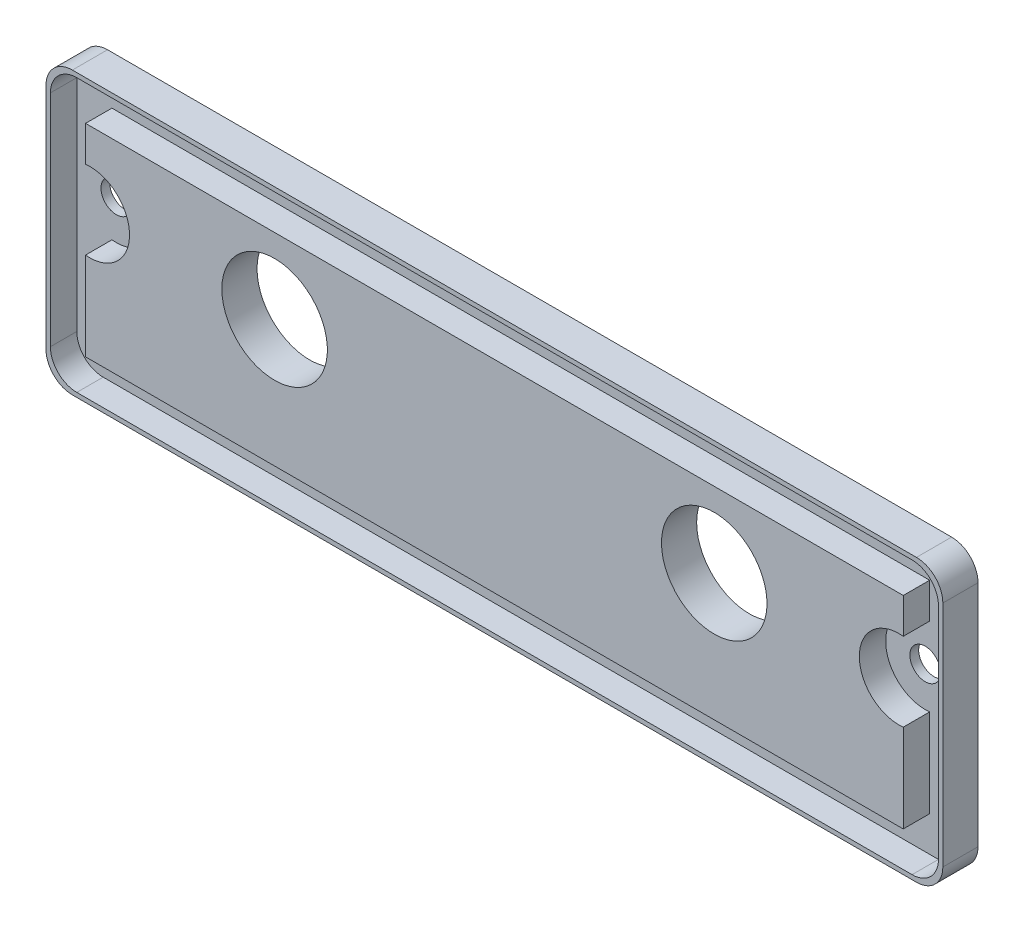
ISO-10303-21;
HEADER;
FILE_DESCRIPTION(('STEP AP214'),'2;1');
FILE_NAME('part.step','',(''),(''),'','','');
FILE_SCHEMA(('AUTOMOTIVE_DESIGN { 1 0 10303 214 1 1 1 1 }'));
ENDSEC;
DATA;
#1=APPLICATION_CONTEXT('core data for automotive mechanical design processes');
#2=APPLICATION_PROTOCOL_DEFINITION('international standard','automotive_design',2000,#1);
#3=PRODUCT_CONTEXT('',#1,'mechanical');
#4=PRODUCT('Part','Part','',(#3));
#5=PRODUCT_RELATED_PRODUCT_CATEGORY('part','',(#4));
#6=PRODUCT_DEFINITION_FORMATION('','',#4);
#7=PRODUCT_DEFINITION_CONTEXT('part definition',#1,'design');
#8=PRODUCT_DEFINITION('design','',#6,#7);
#9=PRODUCT_DEFINITION_SHAPE('','',#8);
#10=(LENGTH_UNIT() NAMED_UNIT(*) SI_UNIT(.MILLI.,.METRE.));
#11=(NAMED_UNIT(*) PLANE_ANGLE_UNIT() SI_UNIT($,.RADIAN.));
#12=(NAMED_UNIT(*) SI_UNIT($,.STERADIAN.) SOLID_ANGLE_UNIT());
#13=UNCERTAINTY_MEASURE_WITH_UNIT(LENGTH_MEASURE(1.E-05),#10,'distance_accuracy_value','');
#14=(GEOMETRIC_REPRESENTATION_CONTEXT(3) GLOBAL_UNCERTAINTY_ASSIGNED_CONTEXT((#13)) GLOBAL_UNIT_ASSIGNED_CONTEXT((#10,
#11,#12)) REPRESENTATION_CONTEXT('',''));
#15=CARTESIAN_POINT('',(0.,0.,0.));
#16=DIRECTION('',(0.,0.,1.));
#17=DIRECTION('',(1.,0.,0.));
#18=AXIS2_PLACEMENT_3D('',#15,#16,#17);
#19=CARTESIAN_POINT('',(0.,0.,1.));
#20=DIRECTION('',(0.,0.,1.));
#21=DIRECTION('',(1.,0.,0.));
#22=AXIS2_PLACEMENT_3D('',#19,#20,#21);
#23=PLANE('',#22);
#24=CARTESIAN_POINT('',(-5.,19.,1.));
#25=DIRECTION('',(0.,0.,1.));
#26=DIRECTION('',(1.,0.,0.));
#27=AXIS2_PLACEMENT_3D('',#24,#25,#26);
#28=CIRCLE('',#27,1.75000000000001);
#29=CARTESIAN_POINT('',(-3.24999999999999,19.,1.));
#30=VERTEX_POINT('',#29);
#31=EDGE_CURVE('E470',#30,#30,#28,.T.);
#32=ORIENTED_EDGE('',*,*,#31,.F.);
#33=EDGE_LOOP('',(#32));
#34=FACE_BOUND('',#33,.T.);
#35=CARTESIAN_POINT('',(-97.,19.,1.));
#36=DIRECTION('',(0.,0.,1.));
#37=DIRECTION('',(1.,0.,0.));
#38=AXIS2_PLACEMENT_3D('',#35,#36,#37);
#39=CIRCLE('',#38,1.75);
#40=CARTESIAN_POINT('',(-95.25,19.,1.));
#41=VERTEX_POINT('',#40);
#42=EDGE_CURVE('E464',#41,#41,#39,.T.);
#43=ORIENTED_EDGE('',*,*,#42,.F.);
#44=EDGE_LOOP('',(#43));
#45=FACE_BOUND('',#44,.T.);
#46=CARTESIAN_POINT('',(-5.,19.,1.));
#47=DIRECTION('',(0.,0.,1.));
#48=DIRECTION('',(1.,0.,0.));
#49=AXIS2_PLACEMENT_3D('',#46,#47,#48);
#50=CIRCLE('',#49,4.5);
#51=CARTESIAN_POINT('',(-4.5,23.4721359549995,1.));
#52=VERTEX_POINT('',#51);
#53=CARTESIAN_POINT('',(-4.5,14.5278640450004,1.));
#54=VERTEX_POINT('',#53);
#55=EDGE_CURVE('E242',#52,#54,#50,.T.);
#56=ORIENTED_EDGE('',*,*,#55,.T.);
#57=DIRECTION('',(0.,-1.,0.));
#58=VECTOR('',#57,1.);
#59=CARTESIAN_POINT('',(-4.5,0.,1.));
#60=LINE('',#59,#58);
#61=CARTESIAN_POINT('',(-4.5,4.49999999999997,1.));
#62=VERTEX_POINT('',#61);
#63=EDGE_CURVE('E260',#54,#62,#60,.T.);
#64=ORIENTED_EDGE('',*,*,#63,.T.);
#65=DIRECTION('',(1.,0.,0.));
#66=VECTOR('',#65,1.);
#67=CARTESIAN_POINT('',(0.,4.49999999999997,1.));
#68=LINE('',#67,#66);
#69=CARTESIAN_POINT('',(-97.5,4.49999999999997,1.));
#70=VERTEX_POINT('',#69);
#71=EDGE_CURVE('E262',#70,#62,#68,.T.);
#72=ORIENTED_EDGE('',*,*,#71,.F.);
#73=DIRECTION('',(0.,-1.,0.));
#74=VECTOR('',#73,1.);
#75=CARTESIAN_POINT('',(-97.5,0.,1.));
#76=LINE('',#75,#74);
#77=CARTESIAN_POINT('',(-97.5,14.5278640450004,1.));
#78=VERTEX_POINT('',#77);
#79=EDGE_CURVE('E291',#78,#70,#76,.T.);
#80=ORIENTED_EDGE('',*,*,#79,.F.);
#81=CARTESIAN_POINT('',(-97.,19.,1.));
#82=DIRECTION('',(0.,0.,1.));
#83=DIRECTION('',(1.,0.,0.));
#84=AXIS2_PLACEMENT_3D('',#81,#82,#83);
#85=CIRCLE('',#84,4.5);
#86=CARTESIAN_POINT('',(-97.5,23.4721359549996,1.));
#87=VERTEX_POINT('',#86);
#88=EDGE_CURVE('E288',#87,#78,#85,.F.);
#89=ORIENTED_EDGE('',*,*,#88,.F.);
#90=DIRECTION('',(0.,-1.,0.));
#91=VECTOR('',#90,1.);
#92=CARTESIAN_POINT('',(-97.5,0.,1.));
#93=LINE('',#92,#91);
#94=CARTESIAN_POINT('',(-97.5,27.5,1.));
#95=VERTEX_POINT('',#94);
#96=EDGE_CURVE('E285',#95,#87,#93,.T.);
#97=ORIENTED_EDGE('',*,*,#96,.F.);
#98=DIRECTION('',(1.,0.,0.));
#99=VECTOR('',#98,1.);
#100=CARTESIAN_POINT('',(0.,27.5,1.));
#101=LINE('',#100,#99);
#102=CARTESIAN_POINT('',(-4.5,27.5,1.));
#103=VERTEX_POINT('',#102);
#104=EDGE_CURVE('E283',#95,#103,#101,.T.);
#105=ORIENTED_EDGE('',*,*,#104,.T.);
#106=DIRECTION('',(0.,1.,0.));
#107=VECTOR('',#106,1.);
#108=CARTESIAN_POINT('',(-4.5,0.,1.));
#109=LINE('',#108,#107);
#110=EDGE_CURVE('E280',#52,#103,#109,.T.);
#111=ORIENTED_EDGE('',*,*,#110,.F.);
#112=EDGE_LOOP('',(#56,#64,#72,#80,#89,#97,#105,#111));
#113=FACE_BOUND('',#112,.T.);
#114=DIRECTION('',(0.,-1.,0.));
#115=VECTOR('',#114,1.);
#116=CARTESIAN_POINT('',(-0.5,0.,1.));
#117=LINE('',#116,#115);
#118=CARTESIAN_POINT('',(-0.5,28.5,1.));
#119=VERTEX_POINT('',#118);
#120=CARTESIAN_POINT('',(-0.5,3.5,1.));
#121=VERTEX_POINT('',#120);
#122=EDGE_CURVE('E454',#119,#121,#117,.T.);
#123=ORIENTED_EDGE('',*,*,#122,.F.);
#124=CARTESIAN_POINT('',(-3.5,28.5,1.));
#125=DIRECTION('',(0.,0.,1.));
#126=DIRECTION('',(1.,0.,0.));
#127=AXIS2_PLACEMENT_3D('',#124,#125,#126);
#128=CIRCLE('',#127,3.);
#129=CARTESIAN_POINT('',(-3.5,31.5,1.));
#130=VERTEX_POINT('',#129);
#131=EDGE_CURVE('E363',#119,#130,#128,.T.);
#132=ORIENTED_EDGE('',*,*,#131,.T.);
#133=DIRECTION('',(1.,0.,0.));
#134=VECTOR('',#133,1.);
#135=CARTESIAN_POINT('',(0.,31.5,1.));
#136=LINE('',#135,#134);
#137=CARTESIAN_POINT('',(-98.5,31.5,1.));
#138=VERTEX_POINT('',#137);
#139=EDGE_CURVE('E451',#138,#130,#136,.T.);
#140=ORIENTED_EDGE('',*,*,#139,.F.);
#141=CARTESIAN_POINT('',(-98.5,28.5,1.));
#142=DIRECTION('',(0.,0.,1.));
#143=DIRECTION('',(1.,0.,0.));
#144=AXIS2_PLACEMENT_3D('',#141,#142,#143);
#145=CIRCLE('',#144,3.);
#146=CARTESIAN_POINT('',(-101.5,28.5,1.));
#147=VERTEX_POINT('',#146);
#148=EDGE_CURVE('E357',#138,#147,#145,.T.);
#149=ORIENTED_EDGE('',*,*,#148,.T.);
#150=DIRECTION('',(0.,-1.,0.));
#151=VECTOR('',#150,1.);
#152=CARTESIAN_POINT('',(-101.5,0.,1.));
#153=LINE('',#152,#151);
#154=CARTESIAN_POINT('',(-101.5,3.5,1.));
#155=VERTEX_POINT('',#154);
#156=EDGE_CURVE('E265',#147,#155,#153,.T.);
#157=ORIENTED_EDGE('',*,*,#156,.T.);
#158=CARTESIAN_POINT('',(-98.5,3.5,1.));
#159=DIRECTION('',(0.,0.,1.));
#160=DIRECTION('',(1.,0.,0.));
#161=AXIS2_PLACEMENT_3D('',#158,#159,#160);
#162=CIRCLE('',#161,3.);
#163=CARTESIAN_POINT('',(-98.5,0.5,1.));
#164=VERTEX_POINT('',#163);
#165=EDGE_CURVE('E359',#155,#164,#162,.T.);
#166=ORIENTED_EDGE('',*,*,#165,.T.);
#167=DIRECTION('',(1.,0.,0.));
#168=VECTOR('',#167,1.);
#169=CARTESIAN_POINT('',(0.,0.5,1.));
#170=LINE('',#169,#168);
#171=CARTESIAN_POINT('',(-3.5,0.5,1.));
#172=VERTEX_POINT('',#171);
#173=EDGE_CURVE('E457',#164,#172,#170,.T.);
#174=ORIENTED_EDGE('',*,*,#173,.T.);
#175=CARTESIAN_POINT('',(-3.5,3.5,1.));
#176=DIRECTION('',(0.,0.,1.));
#177=DIRECTION('',(1.,0.,0.));
#178=AXIS2_PLACEMENT_3D('',#175,#176,#177);
#179=CIRCLE('',#178,3.);
#180=EDGE_CURVE('E361',#172,#121,#179,.T.);
#181=ORIENTED_EDGE('',*,*,#180,.T.);
#182=EDGE_LOOP('',(#123,#132,#140,#149,#157,#166,#174,#181));
#183=FACE_BOUND('',#182,.T.);
#184=ADVANCED_FACE('F72',(#34,#45,#113,#183),#23,.T.);
#185=CARTESIAN_POINT('',(-5.,19.,4.));
#186=DIRECTION('',(0.,0.,-1.));
#187=DIRECTION('',(-1.,0.,0.));
#188=AXIS2_PLACEMENT_3D('',#185,#186,#187);
#189=CYLINDRICAL_SURFACE('',#188,4.5);
#190=ORIENTED_EDGE('',*,*,#55,.F.);
#191=DIRECTION('',(0.,0.,-1.));
#192=VECTOR('',#191,1.);
#193=CARTESIAN_POINT('',(-4.5,23.4721359549995,4.));
#194=LINE('',#193,#192);
#195=CARTESIAN_POINT('',(-4.5,23.4721359549995,4.));
#196=VERTEX_POINT('',#195);
#197=EDGE_CURVE('E235',#196,#52,#194,.T.);
#198=ORIENTED_EDGE('',*,*,#197,.F.);
#199=CARTESIAN_POINT('',(-5.,19.,4.));
#200=DIRECTION('',(0.,0.,1.));
#201=DIRECTION('',(1.,0.,0.));
#202=AXIS2_PLACEMENT_3D('',#199,#200,#201);
#203=CIRCLE('',#202,4.5);
#204=CARTESIAN_POINT('',(-4.5,14.5278640450004,4.));
#205=VERTEX_POINT('',#204);
#206=EDGE_CURVE('E240',#196,#205,#203,.T.);
#207=ORIENTED_EDGE('',*,*,#206,.T.);
#208=DIRECTION('',(0.,0.,-1.));
#209=VECTOR('',#208,1.);
#210=CARTESIAN_POINT('',(-4.5,14.5278640450004,4.));
#211=LINE('',#210,#209);
#212=EDGE_CURVE('E278',#205,#54,#211,.T.);
#213=ORIENTED_EDGE('',*,*,#212,.T.);
#214=EDGE_LOOP('',(#190,#198,#207,#213));
#215=FACE_BOUND('',#214,.T.);
#216=ADVANCED_FACE('F237',(#215),#189,.F.);
#217=CARTESIAN_POINT('',(-4.5,0.,4.));
#218=DIRECTION('',(-1.,0.,0.));
#219=DIRECTION('',(0.,0.,1.));
#220=AXIS2_PLACEMENT_3D('',#217,#218,#219);
#221=PLANE('',#220);
#222=ORIENTED_EDGE('',*,*,#110,.T.);
#223=DIRECTION('',(0.,0.,-1.));
#224=VECTOR('',#223,1.);
#225=CARTESIAN_POINT('',(-4.5,27.5,4.));
#226=LINE('',#225,#224);
#227=CARTESIAN_POINT('',(-4.5,27.5,4.));
#228=VERTEX_POINT('',#227);
#229=EDGE_CURVE('E246',#228,#103,#226,.T.);
#230=ORIENTED_EDGE('',*,*,#229,.F.);
#231=DIRECTION('',(0.,1.,0.));
#232=VECTOR('',#231,1.);
#233=CARTESIAN_POINT('',(-4.5,0.,4.));
#234=LINE('',#233,#232);
#235=EDGE_CURVE('E249',#196,#228,#234,.T.);
#236=ORIENTED_EDGE('',*,*,#235,.F.);
#237=ORIENTED_EDGE('',*,*,#197,.T.);
#238=EDGE_LOOP('',(#222,#230,#236,#237));
#239=FACE_BOUND('',#238,.T.);
#240=ADVANCED_FACE('F250',(#239),#221,.F.);
#241=CARTESIAN_POINT('',(0.,27.5,4.));
#242=DIRECTION('',(0.,1.,0.));
#243=DIRECTION('',(0.,0.,1.));
#244=AXIS2_PLACEMENT_3D('',#241,#242,#243);
#245=PLANE('',#244);
#246=ORIENTED_EDGE('',*,*,#104,.F.);
#247=DIRECTION('',(0.,0.,-1.));
#248=VECTOR('',#247,1.);
#249=CARTESIAN_POINT('',(-97.5,27.5,4.));
#250=LINE('',#249,#248);
#251=CARTESIAN_POINT('',(-97.5,27.5,4.));
#252=VERTEX_POINT('',#251);
#253=EDGE_CURVE('E309',#252,#95,#250,.T.);
#254=ORIENTED_EDGE('',*,*,#253,.F.);
#255=DIRECTION('',(1.,0.,0.));
#256=VECTOR('',#255,1.);
#257=CARTESIAN_POINT('',(0.,27.5,4.));
#258=LINE('',#257,#256);
#259=EDGE_CURVE('E255',#252,#228,#258,.T.);
#260=ORIENTED_EDGE('',*,*,#259,.T.);
#261=ORIENTED_EDGE('',*,*,#229,.T.);
#262=EDGE_LOOP('',(#246,#254,#260,#261));
#263=FACE_BOUND('',#262,.T.);
#264=ADVANCED_FACE('F602',(#263),#245,.T.);
#265=CARTESIAN_POINT('',(-97.5,0.,4.));
#266=DIRECTION('',(1.,0.,0.));
#267=DIRECTION('',(0.,0.,-1.));
#268=AXIS2_PLACEMENT_3D('',#265,#266,#267);
#269=PLANE('',#268);
#270=ORIENTED_EDGE('',*,*,#96,.T.);
#271=DIRECTION('',(0.,0.,-1.));
#272=VECTOR('',#271,1.);
#273=CARTESIAN_POINT('',(-97.5,23.4721359549996,4.));
#274=LINE('',#273,#272);
#275=CARTESIAN_POINT('',(-97.5,23.4721359549996,4.));
#276=VERTEX_POINT('',#275);
#277=EDGE_CURVE('E306',#276,#87,#274,.T.);
#278=ORIENTED_EDGE('',*,*,#277,.F.);
#279=DIRECTION('',(0.,-1.,0.));
#280=VECTOR('',#279,1.);
#281=CARTESIAN_POINT('',(-97.5,0.,4.));
#282=LINE('',#281,#280);
#283=EDGE_CURVE('E269',#252,#276,#282,.T.);
#284=ORIENTED_EDGE('',*,*,#283,.F.);
#285=ORIENTED_EDGE('',*,*,#253,.T.);
#286=EDGE_LOOP('',(#270,#278,#284,#285));
#287=FACE_BOUND('',#286,.T.);
#288=ADVANCED_FACE('F598',(#287),#269,.F.);
#289=CARTESIAN_POINT('',(-97.,19.,4.));
#290=DIRECTION('',(0.,0.,-1.));
#291=DIRECTION('',(-1.,0.,0.));
#292=AXIS2_PLACEMENT_3D('',#289,#290,#291);
#293=CYLINDRICAL_SURFACE('',#292,4.5);
#294=ORIENTED_EDGE('',*,*,#88,.T.);
#295=DIRECTION('',(0.,0.,-1.));
#296=VECTOR('',#295,1.);
#297=CARTESIAN_POINT('',(-97.5,14.5278640450004,4.));
#298=LINE('',#297,#296);
#299=CARTESIAN_POINT('',(-97.5,14.5278640450004,4.));
#300=VERTEX_POINT('',#299);
#301=EDGE_CURVE('E303',#300,#78,#298,.T.);
#302=ORIENTED_EDGE('',*,*,#301,.F.);
#303=CARTESIAN_POINT('',(-97.,19.,4.));
#304=DIRECTION('',(0.,0.,1.));
#305=DIRECTION('',(1.,0.,0.));
#306=AXIS2_PLACEMENT_3D('',#303,#304,#305);
#307=CIRCLE('',#306,4.5);
#308=EDGE_CURVE('E271',#276,#300,#307,.F.);
#309=ORIENTED_EDGE('',*,*,#308,.F.);
#310=ORIENTED_EDGE('',*,*,#277,.T.);
#311=EDGE_LOOP('',(#294,#302,#309,#310));
#312=FACE_BOUND('',#311,.T.);
#313=ADVANCED_FACE('F594',(#312),#293,.F.);
#314=CARTESIAN_POINT('',(-97.5,0.,4.));
#315=DIRECTION('',(1.,0.,0.));
#316=DIRECTION('',(0.,0.,-1.));
#317=AXIS2_PLACEMENT_3D('',#314,#315,#316);
#318=PLANE('',#317);
#319=ORIENTED_EDGE('',*,*,#79,.T.);
#320=DIRECTION('',(0.,0.,-1.));
#321=VECTOR('',#320,1.);
#322=CARTESIAN_POINT('',(-97.5,4.49999999999997,4.));
#323=LINE('',#322,#321);
#324=CARTESIAN_POINT('',(-97.5,4.49999999999997,4.));
#325=VERTEX_POINT('',#324);
#326=EDGE_CURVE('E300',#325,#70,#323,.T.);
#327=ORIENTED_EDGE('',*,*,#326,.F.);
#328=DIRECTION('',(0.,-1.,0.));
#329=VECTOR('',#328,1.);
#330=CARTESIAN_POINT('',(-97.5,0.,4.));
#331=LINE('',#330,#329);
#332=EDGE_CURVE('E273',#300,#325,#331,.T.);
#333=ORIENTED_EDGE('',*,*,#332,.F.);
#334=ORIENTED_EDGE('',*,*,#301,.T.);
#335=EDGE_LOOP('',(#319,#327,#333,#334));
#336=FACE_BOUND('',#335,.T.);
#337=ADVANCED_FACE('F590',(#336),#318,.F.);
#338=CARTESIAN_POINT('',(0.,4.49999999999997,4.));
#339=DIRECTION('',(0.,1.,0.));
#340=DIRECTION('',(0.,0.,1.));
#341=AXIS2_PLACEMENT_3D('',#338,#339,#340);
#342=PLANE('',#341);
#343=ORIENTED_EDGE('',*,*,#71,.T.);
#344=DIRECTION('',(0.,0.,-1.));
#345=VECTOR('',#344,1.);
#346=CARTESIAN_POINT('',(-4.5,4.49999999999997,4.));
#347=LINE('',#346,#345);
#348=CARTESIAN_POINT('',(-4.5,4.49999999999997,4.));
#349=VERTEX_POINT('',#348);
#350=EDGE_CURVE('E297',#349,#62,#347,.T.);
#351=ORIENTED_EDGE('',*,*,#350,.F.);
#352=DIRECTION('',(1.,0.,0.));
#353=VECTOR('',#352,1.);
#354=CARTESIAN_POINT('',(0.,4.49999999999997,4.));
#355=LINE('',#354,#353);
#356=EDGE_CURVE('E275',#325,#349,#355,.T.);
#357=ORIENTED_EDGE('',*,*,#356,.F.);
#358=ORIENTED_EDGE('',*,*,#326,.T.);
#359=EDGE_LOOP('',(#343,#351,#357,#358));
#360=FACE_BOUND('',#359,.T.);
#361=ADVANCED_FACE('F586',(#360),#342,.F.);
#362=CARTESIAN_POINT('',(-4.5,0.,4.));
#363=DIRECTION('',(1.,0.,0.));
#364=DIRECTION('',(0.,0.,-1.));
#365=AXIS2_PLACEMENT_3D('',#362,#363,#364);
#366=PLANE('',#365);
#367=ORIENTED_EDGE('',*,*,#63,.F.);
#368=ORIENTED_EDGE('',*,*,#212,.F.);
#369=DIRECTION('',(0.,-1.,0.));
#370=VECTOR('',#369,1.);
#371=CARTESIAN_POINT('',(-4.5,0.,4.));
#372=LINE('',#371,#370);
#373=EDGE_CURVE('E259',#205,#349,#372,.T.);
#374=ORIENTED_EDGE('',*,*,#373,.T.);
#375=ORIENTED_EDGE('',*,*,#350,.T.);
#376=EDGE_LOOP('',(#367,#368,#374,#375));
#377=FACE_BOUND('',#376,.T.);
#378=ADVANCED_FACE('F583',(#377),#366,.T.);
#379=CARTESIAN_POINT('',(0.,0.,4.));
#380=DIRECTION('',(0.,0.,1.));
#381=DIRECTION('',(1.,0.,0.));
#382=AXIS2_PLACEMENT_3D('',#379,#380,#381);
#383=PLANE('',#382);
#384=CARTESIAN_POINT('',(-76.,18.94,4.));
#385=DIRECTION('',(0.,0.,-1.));
#386=DIRECTION('',(-1.,0.,0.));
#387=AXIS2_PLACEMENT_3D('',#384,#385,#386);
#388=CIRCLE('',#387,6.);
#389=CARTESIAN_POINT('',(-82.,18.94,4.));
#390=VERTEX_POINT('',#389);
#391=EDGE_CURVE('E479',#390,#390,#388,.T.);
#392=ORIENTED_EDGE('',*,*,#391,.T.);
#393=EDGE_LOOP('',(#392));
#394=FACE_BOUND('',#393,.T.);
#395=CARTESIAN_POINT('',(-26.,18.94,4.));
#396=DIRECTION('',(0.,0.,-1.));
#397=DIRECTION('',(-1.,0.,0.));
#398=AXIS2_PLACEMENT_3D('',#395,#396,#397);
#399=CIRCLE('',#398,6.);
#400=CARTESIAN_POINT('',(-32.,18.94,4.));
#401=VERTEX_POINT('',#400);
#402=EDGE_CURVE('E473',#401,#401,#399,.T.);
#403=ORIENTED_EDGE('',*,*,#402,.T.);
#404=EDGE_LOOP('',(#403));
#405=FACE_BOUND('',#404,.T.);
#406=ORIENTED_EDGE('',*,*,#206,.F.);
#407=ORIENTED_EDGE('',*,*,#235,.T.);
#408=ORIENTED_EDGE('',*,*,#259,.F.);
#409=ORIENTED_EDGE('',*,*,#283,.T.);
#410=ORIENTED_EDGE('',*,*,#308,.T.);
#411=ORIENTED_EDGE('',*,*,#332,.T.);
#412=ORIENTED_EDGE('',*,*,#356,.T.);
#413=ORIENTED_EDGE('',*,*,#373,.F.);
#414=EDGE_LOOP('',(#406,#407,#408,#409,#410,#411,#412,#413));
#415=FACE_BOUND('',#414,.T.);
#416=ADVANCED_FACE('F257',(#394,#405,#415),#383,.T.);
#417=CARTESIAN_POINT('',(0.,31.5,4.));
#418=DIRECTION('',(0.,1.,0.));
#419=DIRECTION('',(0.,0.,1.));
#420=AXIS2_PLACEMENT_3D('',#417,#418,#419);
#421=PLANE('',#420);
#422=ORIENTED_EDGE('',*,*,#139,.T.);
#423=DIRECTION('',(0.,0.,-1.));
#424=VECTOR('',#423,1.);
#425=CARTESIAN_POINT('',(-3.5,31.5,4.));
#426=LINE('',#425,#424);
#427=CARTESIAN_POINT('',(-3.5,31.5,4.));
#428=VERTEX_POINT('',#427);
#429=EDGE_CURVE('E368',#130,#428,#426,.F.);
#430=ORIENTED_EDGE('',*,*,#429,.T.);
#431=DIRECTION('',(1.,0.,0.));
#432=VECTOR('',#431,1.);
#433=CARTESIAN_POINT('',(0.,31.5,4.));
#434=LINE('',#433,#432);
#435=CARTESIAN_POINT('',(-98.5,31.5,4.));
#436=VERTEX_POINT('',#435);
#437=EDGE_CURVE('E438',#436,#428,#434,.T.);
#438=ORIENTED_EDGE('',*,*,#437,.F.);
#439=DIRECTION('',(0.,0.,-1.));
#440=VECTOR('',#439,1.);
#441=CARTESIAN_POINT('',(-98.5,31.5,4.));
#442=LINE('',#441,#440);
#443=EDGE_CURVE('E365',#436,#138,#442,.T.);
#444=ORIENTED_EDGE('',*,*,#443,.T.);
#445=EDGE_LOOP('',(#422,#430,#438,#444));
#446=FACE_BOUND('',#445,.T.);
#447=ADVANCED_FACE('F540',(#446),#421,.F.);
#448=CARTESIAN_POINT('',(-0.5,0.,4.));
#449=DIRECTION('',(1.,0.,0.));
#450=DIRECTION('',(0.,1.,0.));
#451=AXIS2_PLACEMENT_3D('',#448,#449,#450);
#452=PLANE('',#451);
#453=DIRECTION('',(0.,-1.,0.));
#454=VECTOR('',#453,1.);
#455=CARTESIAN_POINT('',(-0.5,0.,4.));
#456=LINE('',#455,#454);
#457=CARTESIAN_POINT('',(-0.5,28.5,4.));
#458=VERTEX_POINT('',#457);
#459=CARTESIAN_POINT('',(-0.5,3.5,4.));
#460=VERTEX_POINT('',#459);
#461=EDGE_CURVE('E441',#458,#460,#456,.T.);
#462=ORIENTED_EDGE('',*,*,#461,.F.);
#463=DIRECTION('',(0.,0.,-1.));
#464=VECTOR('',#463,1.);
#465=CARTESIAN_POINT('',(-0.5,28.5,1.));
#466=LINE('',#465,#464);
#467=EDGE_CURVE('E354',#458,#119,#466,.T.);
#468=ORIENTED_EDGE('',*,*,#467,.T.);
#469=ORIENTED_EDGE('',*,*,#122,.T.);
#470=DIRECTION('',(0.,0.,-1.));
#471=VECTOR('',#470,1.);
#472=CARTESIAN_POINT('',(-0.5,3.5,4.));
#473=LINE('',#472,#471);
#474=EDGE_CURVE('E352',#121,#460,#473,.F.);
#475=ORIENTED_EDGE('',*,*,#474,.T.);
#476=EDGE_LOOP('',(#462,#468,#469,#475));
#477=FACE_BOUND('',#476,.T.);
#478=ADVANCED_FACE('F522',(#477),#452,.F.);
#479=CARTESIAN_POINT('',(0.,0.5,4.));
#480=DIRECTION('',(0.,1.,0.));
#481=DIRECTION('',(0.,0.,1.));
#482=AXIS2_PLACEMENT_3D('',#479,#480,#481);
#483=PLANE('',#482);
#484=DIRECTION('',(1.,0.,0.));
#485=VECTOR('',#484,1.);
#486=CARTESIAN_POINT('',(0.,0.5,4.));
#487=LINE('',#486,#485);
#488=CARTESIAN_POINT('',(-98.5,0.5,4.));
#489=VERTEX_POINT('',#488);
#490=CARTESIAN_POINT('',(-3.5,0.5,4.));
#491=VERTEX_POINT('',#490);
#492=EDGE_CURVE('E447',#489,#491,#487,.T.);
#493=ORIENTED_EDGE('',*,*,#492,.T.);
#494=DIRECTION('',(0.,0.,-1.));
#495=VECTOR('',#494,1.);
#496=CARTESIAN_POINT('',(-3.5,0.5,4.));
#497=LINE('',#496,#495);
#498=EDGE_CURVE('E372',#491,#172,#497,.T.);
#499=ORIENTED_EDGE('',*,*,#498,.T.);
#500=ORIENTED_EDGE('',*,*,#173,.F.);
#501=DIRECTION('',(0.,0.,-1.));
#502=VECTOR('',#501,1.);
#503=CARTESIAN_POINT('',(-98.5,0.5,4.));
#504=LINE('',#503,#502);
#505=EDGE_CURVE('E370',#164,#489,#504,.F.);
#506=ORIENTED_EDGE('',*,*,#505,.T.);
#507=EDGE_LOOP('',(#493,#499,#500,#506));
#508=FACE_BOUND('',#507,.T.);
#509=ADVANCED_FACE('F529',(#508),#483,.T.);
#510=CARTESIAN_POINT('',(-101.5,0.,4.));
#511=DIRECTION('',(1.,0.,0.));
#512=DIRECTION('',(0.,0.,-1.));
#513=AXIS2_PLACEMENT_3D('',#510,#511,#512);
#514=PLANE('',#513);
#515=DIRECTION('',(0.,-1.,0.));
#516=VECTOR('',#515,1.);
#517=CARTESIAN_POINT('',(-101.5,0.,4.));
#518=LINE('',#517,#516);
#519=CARTESIAN_POINT('',(-101.5,28.5,4.));
#520=VERTEX_POINT('',#519);
#521=CARTESIAN_POINT('',(-101.5,3.5,4.));
#522=VERTEX_POINT('',#521);
#523=EDGE_CURVE('E281',#520,#522,#518,.T.);
#524=ORIENTED_EDGE('',*,*,#523,.T.);
#525=DIRECTION('',(0.,0.,-1.));
#526=VECTOR('',#525,1.);
#527=CARTESIAN_POINT('',(-101.5,3.5,1.));
#528=LINE('',#527,#526);
#529=EDGE_CURVE('E376',#522,#155,#528,.T.);
#530=ORIENTED_EDGE('',*,*,#529,.T.);
#531=ORIENTED_EDGE('',*,*,#156,.F.);
#532=DIRECTION('',(0.,0.,-1.));
#533=VECTOR('',#532,1.);
#534=CARTESIAN_POINT('',(-101.5,28.5,4.));
#535=LINE('',#534,#533);
#536=EDGE_CURVE('E94',#147,#520,#535,.F.);
#537=ORIENTED_EDGE('',*,*,#536,.T.);
#538=EDGE_LOOP('',(#524,#530,#531,#537));
#539=FACE_BOUND('',#538,.T.);
#540=ADVANCED_FACE('F534',(#539),#514,.T.);
#541=CARTESIAN_POINT('',(0.,0.,4.));
#542=DIRECTION('',(0.,0.,1.));
#543=DIRECTION('',(1.,0.,0.));
#544=AXIS2_PLACEMENT_3D('',#541,#542,#543);
#545=PLANE('',#544);
#546=DIRECTION('',(1.,0.,0.));
#547=VECTOR('',#546,1.);
#548=CARTESIAN_POINT('',(0.,0.,4.));
#549=LINE('',#548,#547);
#550=CARTESIAN_POINT('',(-99.,0.,4.));
#551=VERTEX_POINT('',#550);
#552=CARTESIAN_POINT('',(-3.,0.,4.));
#553=VERTEX_POINT('',#552);
#554=EDGE_CURVE('E425',#551,#553,#549,.T.);
#555=ORIENTED_EDGE('',*,*,#554,.T.);
#556=CARTESIAN_POINT('',(-3.,3.,4.));
#557=DIRECTION('',(0.,0.,1.));
#558=DIRECTION('',(1.,0.,0.));
#559=AXIS2_PLACEMENT_3D('',#556,#557,#558);
#560=CIRCLE('',#559,3.);
#561=CARTESIAN_POINT('',(0.,3.,4.));
#562=VERTEX_POINT('',#561);
#563=EDGE_CURVE('E12',#553,#562,#560,.T.);
#564=ORIENTED_EDGE('',*,*,#563,.T.);
#565=DIRECTION('',(0.,1.,0.));
#566=VECTOR('',#565,1.);
#567=CARTESIAN_POINT('',(0.,0.,4.));
#568=LINE('',#567,#566);
#569=CARTESIAN_POINT('',(0.,29.,4.));
#570=VERTEX_POINT('',#569);
#571=EDGE_CURVE('E399',#562,#570,#568,.T.);
#572=ORIENTED_EDGE('',*,*,#571,.T.);
#573=CARTESIAN_POINT('',(-3.,29.,4.));
#574=DIRECTION('',(0.,0.,1.));
#575=DIRECTION('',(1.,0.,0.));
#576=AXIS2_PLACEMENT_3D('',#573,#574,#575);
#577=CIRCLE('',#576,3.);
#578=CARTESIAN_POINT('',(-3.,32.,4.));
#579=VERTEX_POINT('',#578);
#580=EDGE_CURVE('E80',#570,#579,#577,.T.);
#581=ORIENTED_EDGE('',*,*,#580,.T.);
#582=DIRECTION('',(-1.,0.,0.));
#583=VECTOR('',#582,1.);
#584=CARTESIAN_POINT('',(0.,32.,4.));
#585=LINE('',#584,#583);
#586=CARTESIAN_POINT('',(-99.,32.,4.));
#587=VERTEX_POINT('',#586);
#588=EDGE_CURVE('E396',#579,#587,#585,.T.);
#589=ORIENTED_EDGE('',*,*,#588,.T.);
#590=CARTESIAN_POINT('',(-99.,29.,4.));
#591=DIRECTION('',(0.,0.,1.));
#592=DIRECTION('',(1.,0.,0.));
#593=AXIS2_PLACEMENT_3D('',#590,#591,#592);
#594=CIRCLE('',#593,3.);
#595=CARTESIAN_POINT('',(-102.,29.,4.));
#596=VERTEX_POINT('',#595);
#597=EDGE_CURVE('E388',#587,#596,#594,.T.);
#598=ORIENTED_EDGE('',*,*,#597,.T.);
#599=DIRECTION('',(0.,-1.,0.));
#600=VECTOR('',#599,1.);
#601=CARTESIAN_POINT('',(-102.,0.,4.));
#602=LINE('',#601,#600);
#603=CARTESIAN_POINT('',(-102.,2.99999999999999,4.));
#604=VERTEX_POINT('',#603);
#605=EDGE_CURVE('E407',#596,#604,#602,.T.);
#606=ORIENTED_EDGE('',*,*,#605,.T.);
#607=CARTESIAN_POINT('',(-99.,2.99999999999999,4.));
#608=DIRECTION('',(0.,0.,1.));
#609=DIRECTION('',(1.,0.,0.));
#610=AXIS2_PLACEMENT_3D('',#607,#608,#609);
#611=CIRCLE('',#610,3.);
#612=EDGE_CURVE('E386',#604,#551,#611,.T.);
#613=ORIENTED_EDGE('',*,*,#612,.T.);
#614=EDGE_LOOP('',(#555,#564,#572,#581,#589,#598,#606,#613));
#615=FACE_BOUND('',#614,.T.);
#616=ORIENTED_EDGE('',*,*,#523,.F.);
#617=CARTESIAN_POINT('',(-98.5,28.5,4.));
#618=DIRECTION('',(0.,0.,1.));
#619=DIRECTION('',(1.,0.,0.));
#620=AXIS2_PLACEMENT_3D('',#617,#618,#619);
#621=CIRCLE('',#620,3.);
#622=EDGE_CURVE('E384',#520,#436,#621,.F.);
#623=ORIENTED_EDGE('',*,*,#622,.T.);
#624=ORIENTED_EDGE('',*,*,#437,.T.);
#625=CARTESIAN_POINT('',(-3.5,28.5,4.));
#626=DIRECTION('',(0.,0.,1.));
#627=DIRECTION('',(1.,0.,0.));
#628=AXIS2_PLACEMENT_3D('',#625,#626,#627);
#629=CIRCLE('',#628,3.);
#630=EDGE_CURVE('E379',#428,#458,#629,.F.);
#631=ORIENTED_EDGE('',*,*,#630,.T.);
#632=ORIENTED_EDGE('',*,*,#461,.T.);
#633=CARTESIAN_POINT('',(-3.5,3.5,4.));
#634=DIRECTION('',(0.,0.,1.));
#635=DIRECTION('',(1.,0.,0.));
#636=AXIS2_PLACEMENT_3D('',#633,#634,#635);
#637=CIRCLE('',#636,3.);
#638=EDGE_CURVE('E381',#460,#491,#637,.F.);
#639=ORIENTED_EDGE('',*,*,#638,.T.);
#640=ORIENTED_EDGE('',*,*,#492,.F.);
#641=CARTESIAN_POINT('',(-98.5,3.5,4.));
#642=DIRECTION('',(0.,0.,1.));
#643=DIRECTION('',(1.,0.,0.));
#644=AXIS2_PLACEMENT_3D('',#641,#642,#643);
#645=CIRCLE('',#644,3.);
#646=EDGE_CURVE('E87',#489,#522,#645,.F.);
#647=ORIENTED_EDGE('',*,*,#646,.T.);
#648=EDGE_LOOP('',(#616,#623,#624,#631,#632,#639,#640,#647));
#649=FACE_BOUND('',#648,.T.);
#650=ADVANCED_FACE('F395',(#615,#649),#545,.T.);
#651=CARTESIAN_POINT('',(0.,0.,0.));
#652=DIRECTION('',(0.,0.,1.));
#653=DIRECTION('',(1.,0.,0.));
#654=AXIS2_PLACEMENT_3D('',#651,#652,#653);
#655=PLANE('',#654);
#656=CARTESIAN_POINT('',(-76.,18.94,0.));
#657=DIRECTION('',(0.,0.,-1.));
#658=DIRECTION('',(-1.,0.,0.));
#659=AXIS2_PLACEMENT_3D('',#656,#657,#658);
#660=CIRCLE('',#659,6.);
#661=CARTESIAN_POINT('',(-82.,18.94,0.));
#662=VERTEX_POINT('',#661);
#663=EDGE_CURVE('E482',#662,#662,#660,.T.);
#664=ORIENTED_EDGE('',*,*,#663,.F.);
#665=EDGE_LOOP('',(#664));
#666=FACE_BOUND('',#665,.T.);
#667=CARTESIAN_POINT('',(-26.,18.94,0.));
#668=DIRECTION('',(0.,0.,-1.));
#669=DIRECTION('',(-1.,0.,0.));
#670=AXIS2_PLACEMENT_3D('',#667,#668,#669);
#671=CIRCLE('',#670,6.);
#672=CARTESIAN_POINT('',(-32.,18.94,0.));
#673=VERTEX_POINT('',#672);
#674=EDGE_CURVE('E476',#673,#673,#671,.T.);
#675=ORIENTED_EDGE('',*,*,#674,.F.);
#676=EDGE_LOOP('',(#675));
#677=FACE_BOUND('',#676,.T.);
#678=CARTESIAN_POINT('',(-5.,19.,0.));
#679=DIRECTION('',(0.,0.,1.));
#680=DIRECTION('',(1.,0.,0.));
#681=AXIS2_PLACEMENT_3D('',#678,#679,#680);
#682=CIRCLE('',#681,1.75000000000001);
#683=CARTESIAN_POINT('',(-3.24999999999999,19.,0.));
#684=VERTEX_POINT('',#683);
#685=EDGE_CURVE('E467',#684,#684,#682,.T.);
#686=ORIENTED_EDGE('',*,*,#685,.T.);
#687=EDGE_LOOP('',(#686));
#688=FACE_BOUND('',#687,.T.);
#689=CARTESIAN_POINT('',(-97.,19.,0.));
#690=DIRECTION('',(0.,0.,1.));
#691=DIRECTION('',(1.,0.,0.));
#692=AXIS2_PLACEMENT_3D('',#689,#690,#691);
#693=CIRCLE('',#692,1.75);
#694=CARTESIAN_POINT('',(-95.25,19.,0.));
#695=VERTEX_POINT('',#694);
#696=EDGE_CURVE('E455',#695,#695,#693,.T.);
#697=ORIENTED_EDGE('',*,*,#696,.T.);
#698=EDGE_LOOP('',(#697));
#699=FACE_BOUND('',#698,.T.);
#700=DIRECTION('',(0.,1.,0.));
#701=VECTOR('',#700,1.);
#702=CARTESIAN_POINT('',(0.,0.,0.));
#703=LINE('',#702,#701);
#704=CARTESIAN_POINT('',(0.,3.,0.));
#705=VERTEX_POINT('',#704);
#706=CARTESIAN_POINT('',(0.,29.,0.));
#707=VERTEX_POINT('',#706);
#708=EDGE_CURVE('E245',#705,#707,#703,.T.);
#709=ORIENTED_EDGE('',*,*,#708,.F.);
#710=CARTESIAN_POINT('',(-3.,3.,0.));
#711=DIRECTION('',(0.,0.,1.));
#712=DIRECTION('',(1.,0.,0.));
#713=AXIS2_PLACEMENT_3D('',#710,#711,#712);
#714=CIRCLE('',#713,3.);
#715=CARTESIAN_POINT('',(-3.,0.,0.));
#716=VERTEX_POINT('',#715);
#717=EDGE_CURVE('E335',#705,#716,#714,.F.);
#718=ORIENTED_EDGE('',*,*,#717,.T.);
#719=DIRECTION('',(1.,0.,0.));
#720=VECTOR('',#719,1.);
#721=CARTESIAN_POINT('',(0.,0.,0.));
#722=LINE('',#721,#720);
#723=CARTESIAN_POINT('',(-99.,0.,0.));
#724=VERTEX_POINT('',#723);
#725=EDGE_CURVE('E321',#724,#716,#722,.T.);
#726=ORIENTED_EDGE('',*,*,#725,.F.);
#727=CARTESIAN_POINT('',(-99.,2.99999999999999,0.));
#728=DIRECTION('',(0.,0.,1.));
#729=DIRECTION('',(1.,0.,0.));
#730=AXIS2_PLACEMENT_3D('',#727,#728,#729);
#731=CIRCLE('',#730,3.);
#732=CARTESIAN_POINT('',(-102.,2.99999999999999,0.));
#733=VERTEX_POINT('',#732);
#734=EDGE_CURVE('E329',#724,#733,#731,.F.);
#735=ORIENTED_EDGE('',*,*,#734,.T.);
#736=DIRECTION('',(0.,-1.,0.));
#737=VECTOR('',#736,1.);
#738=CARTESIAN_POINT('',(-102.,0.,0.));
#739=LINE('',#738,#737);
#740=CARTESIAN_POINT('',(-102.,29.,0.));
#741=VERTEX_POINT('',#740);
#742=EDGE_CURVE('E318',#741,#733,#739,.T.);
#743=ORIENTED_EDGE('',*,*,#742,.F.);
#744=CARTESIAN_POINT('',(-99.,29.,0.));
#745=DIRECTION('',(0.,0.,1.));
#746=DIRECTION('',(1.,0.,0.));
#747=AXIS2_PLACEMENT_3D('',#744,#745,#746);
#748=CIRCLE('',#747,3.);
#749=CARTESIAN_POINT('',(-99.,32.,0.));
#750=VERTEX_POINT('',#749);
#751=EDGE_CURVE('E331',#741,#750,#748,.F.);
#752=ORIENTED_EDGE('',*,*,#751,.T.);
#753=DIRECTION('',(-1.,0.,0.));
#754=VECTOR('',#753,1.);
#755=CARTESIAN_POINT('',(0.,32.,0.));
#756=LINE('',#755,#754);
#757=CARTESIAN_POINT('',(-3.,32.,0.));
#758=VERTEX_POINT('',#757);
#759=EDGE_CURVE('E315',#758,#750,#756,.T.);
#760=ORIENTED_EDGE('',*,*,#759,.F.);
#761=CARTESIAN_POINT('',(-3.,29.,0.));
#762=DIRECTION('',(0.,0.,1.));
#763=DIRECTION('',(1.,0.,0.));
#764=AXIS2_PLACEMENT_3D('',#761,#762,#763);
#765=CIRCLE('',#764,3.);
#766=EDGE_CURVE('E333',#758,#707,#765,.F.);
#767=ORIENTED_EDGE('',*,*,#766,.T.);
#768=EDGE_LOOP('',(#709,#718,#726,#735,#743,#752,#760,#767));
#769=FACE_BOUND('',#768,.T.);
#770=ADVANCED_FACE('F412',(#666,#677,#688,#699,#769),#655,.F.);
#771=CARTESIAN_POINT('',(-102.,0.,1.));
#772=DIRECTION('',(1.,0.,0.));
#773=DIRECTION('',(0.,0.,-1.));
#774=AXIS2_PLACEMENT_3D('',#771,#772,#773);
#775=PLANE('',#774);
#776=ORIENTED_EDGE('',*,*,#605,.F.);
#777=DIRECTION('',(0.,0.,-1.));
#778=VECTOR('',#777,1.);
#779=CARTESIAN_POINT('',(-102.,29.,1.));
#780=LINE('',#779,#778);
#781=EDGE_CURVE('E349',#596,#741,#780,.T.);
#782=ORIENTED_EDGE('',*,*,#781,.T.);
#783=ORIENTED_EDGE('',*,*,#742,.T.);
#784=DIRECTION('',(0.,0.,-1.));
#785=VECTOR('',#784,1.);
#786=CARTESIAN_POINT('',(-102.,2.99999999999999,1.));
#787=LINE('',#786,#785);
#788=EDGE_CURVE('E347',#733,#604,#787,.F.);
#789=ORIENTED_EDGE('',*,*,#788,.T.);
#790=EDGE_LOOP('',(#776,#782,#783,#789));
#791=FACE_BOUND('',#790,.T.);
#792=ADVANCED_FACE('F433',(#791),#775,.F.);
#793=CARTESIAN_POINT('',(0.,32.,1.));
#794=DIRECTION('',(0.,-1.,0.));
#795=DIRECTION('',(1.,0.,0.));
#796=AXIS2_PLACEMENT_3D('',#793,#794,#795);
#797=PLANE('',#796);
#798=ORIENTED_EDGE('',*,*,#588,.F.);
#799=DIRECTION('',(0.,0.,-1.));
#800=VECTOR('',#799,1.);
#801=CARTESIAN_POINT('',(-3.,32.,1.));
#802=LINE('',#801,#800);
#803=EDGE_CURVE('E344',#579,#758,#802,.T.);
#804=ORIENTED_EDGE('',*,*,#803,.T.);
#805=ORIENTED_EDGE('',*,*,#759,.T.);
#806=DIRECTION('',(0.,0.,-1.));
#807=VECTOR('',#806,1.);
#808=CARTESIAN_POINT('',(-99.,32.,1.));
#809=LINE('',#808,#807);
#810=EDGE_CURVE('E342',#750,#587,#809,.F.);
#811=ORIENTED_EDGE('',*,*,#810,.T.);
#812=EDGE_LOOP('',(#798,#804,#805,#811));
#813=FACE_BOUND('',#812,.T.);
#814=ADVANCED_FACE('F404',(#813),#797,.F.);
#815=CARTESIAN_POINT('',(0.,0.,1.));
#816=DIRECTION('',(-1.,0.,0.));
#817=DIRECTION('',(0.,0.,1.));
#818=AXIS2_PLACEMENT_3D('',#815,#816,#817);
#819=PLANE('',#818);
#820=ORIENTED_EDGE('',*,*,#571,.F.);
#821=DIRECTION('',(0.,0.,-1.));
#822=VECTOR('',#821,1.);
#823=CARTESIAN_POINT('',(0.,3.,1.));
#824=LINE('',#823,#822);
#825=EDGE_CURVE('E326',#562,#705,#824,.T.);
#826=ORIENTED_EDGE('',*,*,#825,.T.);
#827=ORIENTED_EDGE('',*,*,#708,.T.);
#828=DIRECTION('',(0.,0.,-1.));
#829=VECTOR('',#828,1.);
#830=CARTESIAN_POINT('',(0.,29.,1.));
#831=LINE('',#830,#829);
#832=EDGE_CURVE('E324',#707,#570,#831,.F.);
#833=ORIENTED_EDGE('',*,*,#832,.T.);
#834=EDGE_LOOP('',(#820,#826,#827,#833));
#835=FACE_BOUND('',#834,.T.);
#836=ADVANCED_FACE('F414',(#835),#819,.F.);
#837=CARTESIAN_POINT('',(0.,0.,1.));
#838=DIRECTION('',(0.,1.,0.));
#839=DIRECTION('',(-1.,0.,0.));
#840=AXIS2_PLACEMENT_3D('',#837,#838,#839);
#841=PLANE('',#840);
#842=ORIENTED_EDGE('',*,*,#725,.T.);
#843=DIRECTION('',(0.,0.,-1.));
#844=VECTOR('',#843,1.);
#845=CARTESIAN_POINT('',(-3.,0.,1.));
#846=LINE('',#845,#844);
#847=EDGE_CURVE('E340',#716,#553,#846,.F.);
#848=ORIENTED_EDGE('',*,*,#847,.T.);
#849=ORIENTED_EDGE('',*,*,#554,.F.);
#850=DIRECTION('',(0.,0.,-1.));
#851=VECTOR('',#850,1.);
#852=CARTESIAN_POINT('',(-99.,0.,1.));
#853=LINE('',#852,#851);
#854=EDGE_CURVE('E337',#551,#724,#853,.T.);
#855=ORIENTED_EDGE('',*,*,#854,.T.);
#856=EDGE_LOOP('',(#842,#848,#849,#855));
#857=FACE_BOUND('',#856,.T.);
#858=ADVANCED_FACE('F422',(#857),#841,.F.);
#859=CARTESIAN_POINT('',(-97.,19.,0.));
#860=DIRECTION('',(0.,0.,1.));
#861=DIRECTION('',(1.,0.,0.));
#862=AXIS2_PLACEMENT_3D('',#859,#860,#861);
#863=CYLINDRICAL_SURFACE('',#862,1.75);
#864=ORIENTED_EDGE('',*,*,#696,.F.);
#865=EDGE_LOOP('',(#864));
#866=FACE_BOUND('',#865,.T.);
#867=ORIENTED_EDGE('',*,*,#42,.T.);
#868=EDGE_LOOP('',(#867));
#869=FACE_BOUND('',#868,.T.);
#870=ADVANCED_FACE('F506',(#866,#869),#863,.F.);
#871=CARTESIAN_POINT('',(-5.,19.,0.));
#872=DIRECTION('',(0.,0.,1.));
#873=DIRECTION('',(1.,0.,0.));
#874=AXIS2_PLACEMENT_3D('',#871,#872,#873);
#875=CYLINDRICAL_SURFACE('',#874,1.75000000000001);
#876=ORIENTED_EDGE('',*,*,#685,.F.);
#877=EDGE_LOOP('',(#876));
#878=FACE_BOUND('',#877,.T.);
#879=ORIENTED_EDGE('',*,*,#31,.T.);
#880=EDGE_LOOP('',(#879));
#881=FACE_BOUND('',#880,.T.);
#882=ADVANCED_FACE('F509',(#878,#881),#875,.F.);
#883=CARTESIAN_POINT('',(-3.,3.,1.));
#884=DIRECTION('',(0.,0.,-1.));
#885=DIRECTION('',(-1.,0.,0.));
#886=AXIS2_PLACEMENT_3D('',#883,#884,#885);
#887=CYLINDRICAL_SURFACE('',#886,3.);
#888=ORIENTED_EDGE('',*,*,#563,.F.);
#889=ORIENTED_EDGE('',*,*,#847,.F.);
#890=ORIENTED_EDGE('',*,*,#717,.F.);
#891=ORIENTED_EDGE('',*,*,#825,.F.);
#892=EDGE_LOOP('',(#888,#889,#890,#891));
#893=FACE_BOUND('',#892,.T.);
#894=ADVANCED_FACE('F418',(#893),#887,.T.);
#895=CARTESIAN_POINT('',(-3.,29.,1.));
#896=DIRECTION('',(0.,0.,-1.));
#897=DIRECTION('',(-1.,0.,0.));
#898=AXIS2_PLACEMENT_3D('',#895,#896,#897);
#899=CYLINDRICAL_SURFACE('',#898,3.);
#900=ORIENTED_EDGE('',*,*,#580,.F.);
#901=ORIENTED_EDGE('',*,*,#832,.F.);
#902=ORIENTED_EDGE('',*,*,#766,.F.);
#903=ORIENTED_EDGE('',*,*,#803,.F.);
#904=EDGE_LOOP('',(#900,#901,#902,#903));
#905=FACE_BOUND('',#904,.T.);
#906=ADVANCED_FACE('F409',(#905),#899,.T.);
#907=CARTESIAN_POINT('',(-99.,29.,1.));
#908=DIRECTION('',(0.,0.,-1.));
#909=DIRECTION('',(-1.,0.,0.));
#910=AXIS2_PLACEMENT_3D('',#907,#908,#909);
#911=CYLINDRICAL_SURFACE('',#910,3.);
#912=ORIENTED_EDGE('',*,*,#597,.F.);
#913=ORIENTED_EDGE('',*,*,#810,.F.);
#914=ORIENTED_EDGE('',*,*,#751,.F.);
#915=ORIENTED_EDGE('',*,*,#781,.F.);
#916=EDGE_LOOP('',(#912,#913,#914,#915));
#917=FACE_BOUND('',#916,.T.);
#918=ADVANCED_FACE('F437',(#917),#911,.T.);
#919=CARTESIAN_POINT('',(-99.,2.99999999999999,1.));
#920=DIRECTION('',(0.,0.,-1.));
#921=DIRECTION('',(-1.,0.,0.));
#922=AXIS2_PLACEMENT_3D('',#919,#920,#921);
#923=CYLINDRICAL_SURFACE('',#922,3.);
#924=ORIENTED_EDGE('',*,*,#612,.F.);
#925=ORIENTED_EDGE('',*,*,#788,.F.);
#926=ORIENTED_EDGE('',*,*,#734,.F.);
#927=ORIENTED_EDGE('',*,*,#854,.F.);
#928=EDGE_LOOP('',(#924,#925,#926,#927));
#929=FACE_BOUND('',#928,.T.);
#930=ADVANCED_FACE('F428',(#929),#923,.T.);
#931=CARTESIAN_POINT('',(-3.5,28.5,4.));
#932=DIRECTION('',(0.,0.,1.));
#933=DIRECTION('',(1.,0.,0.));
#934=AXIS2_PLACEMENT_3D('',#931,#932,#933);
#935=CYLINDRICAL_SURFACE('',#934,3.);
#936=ORIENTED_EDGE('',*,*,#630,.F.);
#937=ORIENTED_EDGE('',*,*,#429,.F.);
#938=ORIENTED_EDGE('',*,*,#131,.F.);
#939=ORIENTED_EDGE('',*,*,#467,.F.);
#940=EDGE_LOOP('',(#936,#937,#938,#939));
#941=FACE_BOUND('',#940,.T.);
#942=ADVANCED_FACE('F544',(#941),#935,.F.);
#943=CARTESIAN_POINT('',(-3.5,3.5,4.));
#944=DIRECTION('',(0.,0.,-1.));
#945=DIRECTION('',(-1.,0.,0.));
#946=AXIS2_PLACEMENT_3D('',#943,#944,#945);
#947=CYLINDRICAL_SURFACE('',#946,3.);
#948=ORIENTED_EDGE('',*,*,#638,.F.);
#949=ORIENTED_EDGE('',*,*,#474,.F.);
#950=ORIENTED_EDGE('',*,*,#180,.F.);
#951=ORIENTED_EDGE('',*,*,#498,.F.);
#952=EDGE_LOOP('',(#948,#949,#950,#951));
#953=FACE_BOUND('',#952,.T.);
#954=ADVANCED_FACE('F526',(#953),#947,.F.);
#955=CARTESIAN_POINT('',(-98.5,3.5,4.));
#956=DIRECTION('',(0.,0.,1.));
#957=DIRECTION('',(1.,0.,0.));
#958=AXIS2_PLACEMENT_3D('',#955,#956,#957);
#959=CYLINDRICAL_SURFACE('',#958,3.);
#960=ORIENTED_EDGE('',*,*,#646,.F.);
#961=ORIENTED_EDGE('',*,*,#505,.F.);
#962=ORIENTED_EDGE('',*,*,#165,.F.);
#963=ORIENTED_EDGE('',*,*,#529,.F.);
#964=EDGE_LOOP('',(#960,#961,#962,#963));
#965=FACE_BOUND('',#964,.T.);
#966=ADVANCED_FACE('F532',(#965),#959,.F.);
#967=CARTESIAN_POINT('',(-98.5,28.5,4.));
#968=DIRECTION('',(0.,0.,-1.));
#969=DIRECTION('',(-1.,0.,0.));
#970=AXIS2_PLACEMENT_3D('',#967,#968,#969);
#971=CYLINDRICAL_SURFACE('',#970,3.);
#972=ORIENTED_EDGE('',*,*,#622,.F.);
#973=ORIENTED_EDGE('',*,*,#536,.F.);
#974=ORIENTED_EDGE('',*,*,#148,.F.);
#975=ORIENTED_EDGE('',*,*,#443,.F.);
#976=EDGE_LOOP('',(#972,#973,#974,#975));
#977=FACE_BOUND('',#976,.T.);
#978=ADVANCED_FACE('F74',(#977),#971,.F.);
#979=CARTESIAN_POINT('',(-26.,18.94,4.));
#980=DIRECTION('',(0.,0.,-1.));
#981=DIRECTION('',(-1.,0.,0.));
#982=AXIS2_PLACEMENT_3D('',#979,#980,#981);
#983=CYLINDRICAL_SURFACE('',#982,6.);
#984=ORIENTED_EDGE('',*,*,#402,.F.);
#985=EDGE_LOOP('',(#984));
#986=FACE_BOUND('',#985,.T.);
#987=ORIENTED_EDGE('',*,*,#674,.T.);
#988=EDGE_LOOP('',(#987));
#989=FACE_BOUND('',#988,.T.);
#990=ADVANCED_FACE('F493',(#986,#989),#983,.F.);
#991=CARTESIAN_POINT('',(-76.,18.94,4.));
#992=DIRECTION('',(0.,0.,-1.));
#993=DIRECTION('',(-1.,0.,0.));
#994=AXIS2_PLACEMENT_3D('',#991,#992,#993);
#995=CYLINDRICAL_SURFACE('',#994,6.);
#996=ORIENTED_EDGE('',*,*,#391,.F.);
#997=EDGE_LOOP('',(#996));
#998=FACE_BOUND('',#997,.T.);
#999=ORIENTED_EDGE('',*,*,#663,.T.);
#1000=EDGE_LOOP('',(#999));
#1001=FACE_BOUND('',#1000,.T.);
#1002=ADVANCED_FACE('F490',(#998,#1001),#995,.F.);
#1003=CLOSED_SHELL('',(#184,#216,#240,#264,#288,#313,#337,#361,#378,#416,#447,#478,#509,#540,
#650,#770,#792,#814,#836,#858,#870,#882,#894,#906,#918,#930,#942,#954,#966,#978,#990,#1002));
#1004=MANIFOLD_SOLID_BREP('B2',#1003);
#1005=ADVANCED_BREP_SHAPE_REPRESENTATION('',(#18,#1004),#14);
#1006=SHAPE_DEFINITION_REPRESENTATION(#9,#1005);
ENDSEC;
END-ISO-10303-21;
